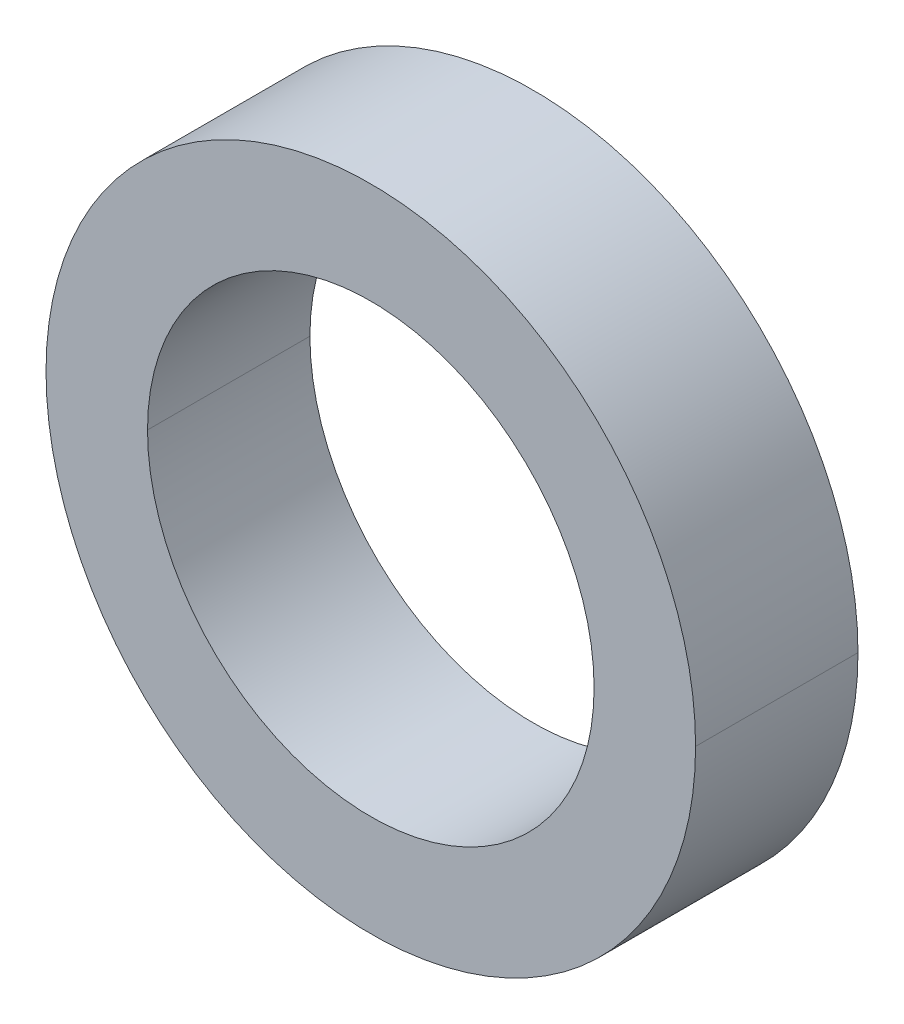
ISO-10303-21;
HEADER;
FILE_DESCRIPTION(('STEP AP214'),'2;1');
FILE_NAME('part.step','',(''),(''),'','','');
FILE_SCHEMA(('AUTOMOTIVE_DESIGN { 1 0 10303 214 1 1 1 1 }'));
ENDSEC;
DATA;
#1=APPLICATION_CONTEXT('core data for automotive mechanical design processes');
#2=APPLICATION_PROTOCOL_DEFINITION('international standard','automotive_design',2000,#1);
#3=PRODUCT_CONTEXT('',#1,'mechanical');
#4=PRODUCT('Part','Part','',(#3));
#5=PRODUCT_RELATED_PRODUCT_CATEGORY('part','',(#4));
#6=PRODUCT_DEFINITION_FORMATION('','',#4);
#7=PRODUCT_DEFINITION_CONTEXT('part definition',#1,'design');
#8=PRODUCT_DEFINITION('design','',#6,#7);
#9=PRODUCT_DEFINITION_SHAPE('','',#8);
#10=(LENGTH_UNIT() NAMED_UNIT(*) SI_UNIT(.MILLI.,.METRE.));
#11=(NAMED_UNIT(*) PLANE_ANGLE_UNIT() SI_UNIT($,.RADIAN.));
#12=(NAMED_UNIT(*) SI_UNIT($,.STERADIAN.) SOLID_ANGLE_UNIT());
#13=UNCERTAINTY_MEASURE_WITH_UNIT(LENGTH_MEASURE(1.E-05),#10,'distance_accuracy_value','');
#14=(GEOMETRIC_REPRESENTATION_CONTEXT(3) GLOBAL_UNCERTAINTY_ASSIGNED_CONTEXT((#13)) GLOBAL_UNIT_ASSIGNED_CONTEXT((#10,
#11,#12)) REPRESENTATION_CONTEXT('',''));
#15=CARTESIAN_POINT('',(0.,0.,0.));
#16=DIRECTION('',(0.,0.,1.));
#17=DIRECTION('',(1.,0.,0.));
#18=AXIS2_PLACEMENT_3D('',#15,#16,#17);
#19=CARTESIAN_POINT('',(0.,0.,4.));
#20=DIRECTION('',(0.,0.,-1.));
#21=DIRECTION('',(-1.,0.,0.));
#22=AXIS2_PLACEMENT_3D('',#19,#20,#21);
#23=CYLINDRICAL_SURFACE('',#22,5.5);
#24=CARTESIAN_POINT('',(0.,0.,4.));
#25=DIRECTION('',(0.,0.,1.));
#26=DIRECTION('',(1.,0.,0.));
#27=AXIS2_PLACEMENT_3D('',#24,#25,#26);
#28=CIRCLE('',#27,5.5);
#29=CARTESIAN_POINT('',(-5.5,0.,4.));
#30=VERTEX_POINT('',#29);
#31=CARTESIAN_POINT('',(5.5,0.,4.));
#32=VERTEX_POINT('',#31);
#33=EDGE_CURVE('E11',#30,#32,#28,.T.);
#34=ORIENTED_EDGE('',*,*,#33,.T.);
#35=DIRECTION('',(0.,0.,-1.));
#36=VECTOR('',#35,1.);
#37=CARTESIAN_POINT('',(5.5,0.,4.));
#38=LINE('',#37,#36);
#39=CARTESIAN_POINT('',(5.5,0.,0.));
#40=VERTEX_POINT('',#39);
#41=EDGE_CURVE('E28',#32,#40,#38,.T.);
#42=ORIENTED_EDGE('',*,*,#41,.T.);
#43=CARTESIAN_POINT('',(0.,0.,0.));
#44=DIRECTION('',(0.,0.,1.));
#45=DIRECTION('',(1.,0.,0.));
#46=AXIS2_PLACEMENT_3D('',#43,#44,#45);
#47=CIRCLE('',#46,5.5);
#48=CARTESIAN_POINT('',(-5.5,0.,0.));
#49=VERTEX_POINT('',#48);
#50=EDGE_CURVE('E71',#49,#40,#47,.T.);
#51=ORIENTED_EDGE('',*,*,#50,.F.);
#52=DIRECTION('',(0.,0.,-1.));
#53=VECTOR('',#52,1.);
#54=CARTESIAN_POINT('',(-5.5,0.,4.));
#55=LINE('',#54,#53);
#56=EDGE_CURVE('E21',#30,#49,#55,.T.);
#57=ORIENTED_EDGE('',*,*,#56,.F.);
#58=EDGE_LOOP('',(#34,#42,#51,#57));
#59=FACE_BOUND('',#58,.T.);
#60=ADVANCED_FACE('F17',(#59),#23,.F.);
#61=CARTESIAN_POINT('',(0.,0.,4.));
#62=DIRECTION('',(0.,0.,-1.));
#63=DIRECTION('',(-1.,0.,0.));
#64=AXIS2_PLACEMENT_3D('',#61,#62,#63);
#65=CYLINDRICAL_SURFACE('',#64,8.);
#66=CARTESIAN_POINT('',(0.,0.,4.));
#67=DIRECTION('',(0.,0.,1.));
#68=DIRECTION('',(1.,0.,0.));
#69=AXIS2_PLACEMENT_3D('',#66,#67,#68);
#70=CIRCLE('',#69,8.);
#71=CARTESIAN_POINT('',(8.,0.,4.));
#72=VERTEX_POINT('',#71);
#73=CARTESIAN_POINT('',(-8.,0.,4.));
#74=VERTEX_POINT('',#73);
#75=EDGE_CURVE('E90',#72,#74,#70,.T.);
#76=ORIENTED_EDGE('',*,*,#75,.F.);
#77=DIRECTION('',(0.,0.,-1.));
#78=VECTOR('',#77,1.);
#79=CARTESIAN_POINT('',(8.,0.,4.));
#80=LINE('',#79,#78);
#81=CARTESIAN_POINT('',(8.,0.,0.));
#82=VERTEX_POINT('',#81);
#83=EDGE_CURVE('E105',#72,#82,#80,.T.);
#84=ORIENTED_EDGE('',*,*,#83,.T.);
#85=CARTESIAN_POINT('',(0.,0.,0.));
#86=DIRECTION('',(0.,0.,1.));
#87=DIRECTION('',(1.,0.,0.));
#88=AXIS2_PLACEMENT_3D('',#85,#86,#87);
#89=CIRCLE('',#88,8.);
#90=CARTESIAN_POINT('',(-8.,0.,0.));
#91=VERTEX_POINT('',#90);
#92=EDGE_CURVE('E100',#82,#91,#89,.T.);
#93=ORIENTED_EDGE('',*,*,#92,.T.);
#94=DIRECTION('',(0.,0.,-1.));
#95=VECTOR('',#94,1.);
#96=CARTESIAN_POINT('',(-8.,0.,4.));
#97=LINE('',#96,#95);
#98=EDGE_CURVE('E86',#74,#91,#97,.T.);
#99=ORIENTED_EDGE('',*,*,#98,.F.);
#100=EDGE_LOOP('',(#76,#84,#93,#99));
#101=FACE_BOUND('',#100,.T.);
#102=ADVANCED_FACE('F115',(#101),#65,.T.);
#103=CARTESIAN_POINT('',(0.,0.,4.));
#104=DIRECTION('',(0.,0.,1.));
#105=DIRECTION('',(1.,0.,0.));
#106=AXIS2_PLACEMENT_3D('',#103,#104,#105);
#107=PLANE('',#106);
#108=CARTESIAN_POINT('',(0.,0.,4.));
#109=DIRECTION('',(0.,0.,1.));
#110=DIRECTION('',(1.,0.,0.));
#111=AXIS2_PLACEMENT_3D('',#108,#109,#110);
#112=CIRCLE('',#111,8.);
#113=EDGE_CURVE('E93',#74,#72,#112,.T.);
#114=ORIENTED_EDGE('',*,*,#113,.T.);
#115=ORIENTED_EDGE('',*,*,#75,.T.);
#116=EDGE_LOOP('',(#114,#115));
#117=FACE_BOUND('',#116,.T.);
#118=ORIENTED_EDGE('',*,*,#33,.F.);
#119=CARTESIAN_POINT('',(0.,0.,4.));
#120=DIRECTION('',(0.,0.,1.));
#121=DIRECTION('',(1.,0.,0.));
#122=AXIS2_PLACEMENT_3D('',#119,#120,#121);
#123=CIRCLE('',#122,5.5);
#124=EDGE_CURVE('E74',#32,#30,#123,.T.);
#125=ORIENTED_EDGE('',*,*,#124,.F.);
#126=EDGE_LOOP('',(#118,#125));
#127=FACE_BOUND('',#126,.T.);
#128=ADVANCED_FACE('F19',(#117,#127),#107,.T.);
#129=CARTESIAN_POINT('',(0.,0.,0.));
#130=DIRECTION('',(0.,0.,1.));
#131=DIRECTION('',(1.,0.,0.));
#132=AXIS2_PLACEMENT_3D('',#129,#130,#131);
#133=PLANE('',#132);
#134=CARTESIAN_POINT('',(0.,0.,0.));
#135=DIRECTION('',(0.,0.,1.));
#136=DIRECTION('',(1.,0.,0.));
#137=AXIS2_PLACEMENT_3D('',#134,#135,#136);
#138=CIRCLE('',#137,8.);
#139=EDGE_CURVE('E78',#91,#82,#138,.T.);
#140=ORIENTED_EDGE('',*,*,#139,.F.);
#141=ORIENTED_EDGE('',*,*,#92,.F.);
#142=EDGE_LOOP('',(#140,#141));
#143=FACE_BOUND('',#142,.T.);
#144=ORIENTED_EDGE('',*,*,#50,.T.);
#145=CARTESIAN_POINT('',(0.,0.,0.));
#146=DIRECTION('',(0.,0.,1.));
#147=DIRECTION('',(1.,0.,0.));
#148=AXIS2_PLACEMENT_3D('',#145,#146,#147);
#149=CIRCLE('',#148,5.5);
#150=EDGE_CURVE('E94',#40,#49,#149,.T.);
#151=ORIENTED_EDGE('',*,*,#150,.T.);
#152=EDGE_LOOP('',(#144,#151));
#153=FACE_BOUND('',#152,.T.);
#154=ADVANCED_FACE('F118',(#143,#153),#133,.F.);
#155=CARTESIAN_POINT('',(0.,0.,4.));
#156=DIRECTION('',(0.,0.,-1.));
#157=DIRECTION('',(-1.,0.,0.));
#158=AXIS2_PLACEMENT_3D('',#155,#156,#157);
#159=CYLINDRICAL_SURFACE('',#158,8.);
#160=ORIENTED_EDGE('',*,*,#83,.F.);
#161=ORIENTED_EDGE('',*,*,#113,.F.);
#162=ORIENTED_EDGE('',*,*,#98,.T.);
#163=ORIENTED_EDGE('',*,*,#139,.T.);
#164=EDGE_LOOP('',(#160,#161,#162,#163));
#165=FACE_BOUND('',#164,.T.);
#166=ADVANCED_FACE('F121',(#165),#159,.T.);
#167=CARTESIAN_POINT('',(0.,0.,4.));
#168=DIRECTION('',(0.,0.,-1.));
#169=DIRECTION('',(-1.,0.,0.));
#170=AXIS2_PLACEMENT_3D('',#167,#168,#169);
#171=CYLINDRICAL_SURFACE('',#170,5.5);
#172=ORIENTED_EDGE('',*,*,#41,.F.);
#173=ORIENTED_EDGE('',*,*,#124,.T.);
#174=ORIENTED_EDGE('',*,*,#56,.T.);
#175=ORIENTED_EDGE('',*,*,#150,.F.);
#176=EDGE_LOOP('',(#172,#173,#174,#175));
#177=FACE_BOUND('',#176,.T.);
#178=ADVANCED_FACE('F76',(#177),#171,.F.);
#179=CLOSED_SHELL('',(#60,#102,#128,#154,#166,#178));
#180=MANIFOLD_SOLID_BREP('B1',#179);
#181=ADVANCED_BREP_SHAPE_REPRESENTATION('',(#18,#180),#14);
#182=SHAPE_DEFINITION_REPRESENTATION(#9,#181);
ENDSEC;
END-ISO-10303-21;
